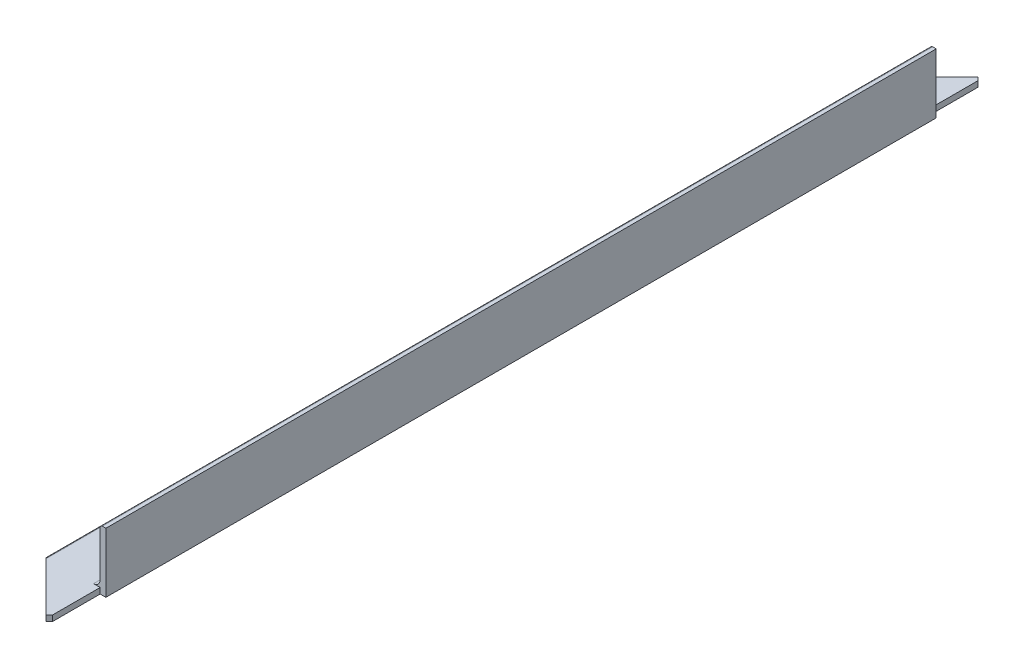
ISO-10303-21;
HEADER;
FILE_DESCRIPTION(('STEP AP214'),'2;1');
FILE_NAME('part.step','',(''),(''),'','','');
FILE_SCHEMA(('AUTOMOTIVE_DESIGN { 1 0 10303 214 1 1 1 1 }'));
ENDSEC;
DATA;
#1=APPLICATION_CONTEXT('core data for automotive mechanical design processes');
#2=APPLICATION_PROTOCOL_DEFINITION('international standard','automotive_design',2000,#1);
#3=PRODUCT_CONTEXT('',#1,'mechanical');
#4=PRODUCT('Part','Part','',(#3));
#5=PRODUCT_RELATED_PRODUCT_CATEGORY('part','',(#4));
#6=PRODUCT_DEFINITION_FORMATION('','',#4);
#7=PRODUCT_DEFINITION_CONTEXT('part definition',#1,'design');
#8=PRODUCT_DEFINITION('design','',#6,#7);
#9=PRODUCT_DEFINITION_SHAPE('','',#8);
#10=(LENGTH_UNIT() NAMED_UNIT(*) SI_UNIT(.MILLI.,.METRE.));
#11=(NAMED_UNIT(*) PLANE_ANGLE_UNIT() SI_UNIT($,.RADIAN.));
#12=(NAMED_UNIT(*) SI_UNIT($,.STERADIAN.) SOLID_ANGLE_UNIT());
#13=UNCERTAINTY_MEASURE_WITH_UNIT(LENGTH_MEASURE(1.E-05),#10,'distance_accuracy_value','');
#14=(GEOMETRIC_REPRESENTATION_CONTEXT(3) GLOBAL_UNCERTAINTY_ASSIGNED_CONTEXT((#13)) GLOBAL_UNIT_ASSIGNED_CONTEXT((#10,
#11,#12)) REPRESENTATION_CONTEXT('',''));
#15=CARTESIAN_POINT('',(0.,0.,0.));
#16=DIRECTION('',(0.,0.,1.));
#17=DIRECTION('',(1.,0.,0.));
#18=AXIS2_PLACEMENT_3D('',#15,#16,#17);
#19=CARTESIAN_POINT('',(737.,213.,-500.));
#20=DIRECTION('',(0.,0.,1.));
#21=DIRECTION('',(1.,0.,0.));
#22=AXIS2_PLACEMENT_3D('',#19,#20,#21);
#23=CYLINDRICAL_SURFACE('',#22,7.00000000000001);
#24=CARTESIAN_POINT('',(737.,213.,437.));
#25=DIRECTION('',(0.,0.,1.));
#26=DIRECTION('',(1.,0.,0.));
#27=AXIS2_PLACEMENT_3D('',#24,#25,#26);
#28=CIRCLE('',#27,7.00000000000001);
#29=CARTESIAN_POINT('',(744.00000000001,213.,437.));
#30=VERTEX_POINT('',#29);
#31=CARTESIAN_POINT('',(737.00000000001,206.,437.));
#32=VERTEX_POINT('',#31);
#33=EDGE_CURVE('E162',#30,#32,#28,.F.);
#34=ORIENTED_EDGE('',*,*,#33,.F.);
#35=DIRECTION('',(0.,0.,1.));
#36=VECTOR('',#35,1.);
#37=CARTESIAN_POINT('',(744.,213.,-500.));
#38=LINE('',#37,#36);
#39=CARTESIAN_POINT('',(744.,213.,-437.));
#40=VERTEX_POINT('',#39);
#41=EDGE_CURVE('E208',#40,#30,#38,.T.);
#42=ORIENTED_EDGE('',*,*,#41,.F.);
#43=CARTESIAN_POINT('',(737.,213.,-437.));
#44=DIRECTION('',(0.,0.,-1.));
#45=DIRECTION('',(-1.,0.,0.));
#46=AXIS2_PLACEMENT_3D('',#43,#44,#45);
#47=CIRCLE('',#46,7.00000000000001);
#48=CARTESIAN_POINT('',(737.,206.,-437.));
#49=VERTEX_POINT('',#48);
#50=EDGE_CURVE('E44',#49,#40,#47,.F.);
#51=ORIENTED_EDGE('',*,*,#50,.F.);
#52=DIRECTION('',(0.,0.,1.));
#53=VECTOR('',#52,1.);
#54=CARTESIAN_POINT('',(737.,206.,-500.));
#55=LINE('',#54,#53);
#56=EDGE_CURVE('E240',#49,#32,#55,.T.);
#57=ORIENTED_EDGE('',*,*,#56,.T.);
#58=EDGE_LOOP('',(#34,#42,#51,#57));
#59=FACE_BOUND('',#58,.T.);
#60=ADVANCED_FACE('F36',(#59),#23,.F.);
#61=CARTESIAN_POINT('',(750.,200.,500.));
#62=DIRECTION('',(-0.707106781186547,0.,0.707106781186548));
#63=DIRECTION('',(0.707106781186548,0.,0.707106781186547));
#64=AXIS2_PLACEMENT_3D('',#61,#62,#63);
#65=PLANE('',#64);
#66=DIRECTION('',(0.,-1.,0.));
#67=VECTOR('',#66,1.);
#68=CARTESIAN_POINT('',(740.5,200.,490.5));
#69=LINE('',#68,#67);
#70=CARTESIAN_POINT('',(740.5,206.,490.5));
#71=VERTEX_POINT('',#70);
#72=CARTESIAN_POINT('',(740.5,200.,490.5));
#73=VERTEX_POINT('',#72);
#74=EDGE_CURVE('E187',#71,#73,#69,.T.);
#75=ORIENTED_EDGE('',*,*,#74,.F.);
#76=DIRECTION('',(-0.707106781186548,0.,-0.707106781186547));
#77=VECTOR('',#76,1.);
#78=CARTESIAN_POINT('',(243.5,206.,-6.49999999999962));
#79=LINE('',#78,#77);
#80=CARTESIAN_POINT('',(689.3,206.,439.3));
#81=VERTEX_POINT('',#80);
#82=EDGE_CURVE('E50',#71,#81,#79,.T.);
#83=ORIENTED_EDGE('',*,*,#82,.T.);
#84=CARTESIAN_POINT('',(689.3,203.7,439.3));
#85=DIRECTION('',(-0.707106781186547,0.,0.707106781186548));
#86=DIRECTION('',(0.707106781186548,0.,0.707106781186547));
#87=AXIS2_PLACEMENT_3D('',#84,#85,#86);
#88=ELLIPSE('',#87,3.25269119345807,2.29999999999997);
#89=CARTESIAN_POINT('',(687.,203.7,437.));
#90=VERTEX_POINT('',#89);
#91=EDGE_CURVE('E182',#81,#90,#88,.T.);
#92=ORIENTED_EDGE('',*,*,#91,.T.);
#93=DIRECTION('',(0.,1.,0.));
#94=VECTOR('',#93,1.);
#95=CARTESIAN_POINT('',(687.,203.70000000001,437.));
#96=LINE('',#95,#94);
#97=CARTESIAN_POINT('',(687.,200.,437.));
#98=VERTEX_POINT('',#97);
#99=EDGE_CURVE('E190',#98,#90,#96,.T.);
#100=ORIENTED_EDGE('',*,*,#99,.F.);
#101=DIRECTION('',(0.707106781186548,0.,0.707106781186547));
#102=VECTOR('',#101,1.);
#103=CARTESIAN_POINT('',(250.,200.,3.33066907387547E-13));
#104=LINE('',#103,#102);
#105=EDGE_CURVE('E176',#98,#73,#104,.T.);
#106=ORIENTED_EDGE('',*,*,#105,.T.);
#107=EDGE_LOOP('',(#75,#83,#92,#100,#106));
#108=FACE_BOUND('',#107,.T.);
#109=ADVANCED_FACE('F302',(#108),#65,.T.);
#110=CARTESIAN_POINT('',(744.,0.,439.3));
#111=DIRECTION('',(1.,0.,0.));
#112=DIRECTION('',(0.,0.,-1.));
#113=AXIS2_PLACEMENT_3D('',#110,#111,#112);
#114=PLANE('',#113);
#115=DIRECTION('',(0.,1.,0.));
#116=VECTOR('',#115,1.);
#117=CARTESIAN_POINT('',(744.,0.,437.));
#118=LINE('',#117,#116);
#119=CARTESIAN_POINT('',(744.,200.,437.));
#120=VERTEX_POINT('',#119);
#121=CARTESIAN_POINT('',(744.00000000001,206.,437.));
#122=VERTEX_POINT('',#121);
#123=EDGE_CURVE('E82',#120,#122,#118,.T.);
#124=ORIENTED_EDGE('',*,*,#123,.T.);
#125=DIRECTION('',(0.,0.,-1.));
#126=VECTOR('',#125,1.);
#127=CARTESIAN_POINT('',(744.000000000011,206.,490.5));
#128=LINE('',#127,#126);
#129=CARTESIAN_POINT('',(744.000000000011,206.,487.));
#130=VERTEX_POINT('',#129);
#131=EDGE_CURVE('E153',#130,#122,#128,.T.);
#132=ORIENTED_EDGE('',*,*,#131,.F.);
#133=DIRECTION('',(0.,1.,0.));
#134=VECTOR('',#133,1.);
#135=CARTESIAN_POINT('',(744.,0.,487.));
#136=LINE('',#135,#134);
#137=CARTESIAN_POINT('',(744.,200.,487.));
#138=VERTEX_POINT('',#137);
#139=EDGE_CURVE('E174',#138,#130,#136,.T.);
#140=ORIENTED_EDGE('',*,*,#139,.F.);
#141=DIRECTION('',(0.,0.,-1.));
#142=VECTOR('',#141,1.);
#143=CARTESIAN_POINT('',(744.000000000008,200.,-500.));
#144=LINE('',#143,#142);
#145=EDGE_CURVE('E170',#138,#120,#144,.T.);
#146=ORIENTED_EDGE('',*,*,#145,.T.);
#147=EDGE_LOOP('',(#124,#132,#140,#146));
#148=FACE_BOUND('',#147,.T.);
#149=ADVANCED_FACE('F168',(#148),#114,.T.);
#150=CARTESIAN_POINT('',(744.,0.,487.));
#151=DIRECTION('',(-0.707106781186547,0.,-0.707106781186548));
#152=DIRECTION('',(-0.707106781186548,0.,0.707106781186547));
#153=AXIS2_PLACEMENT_3D('',#150,#151,#152);
#154=PLANE('',#153);
#155=DIRECTION('',(0.707106781186548,0.,-0.707106781186547));
#156=VECTOR('',#155,1.);
#157=CARTESIAN_POINT('',(744.,206.,487.));
#158=LINE('',#157,#156);
#159=EDGE_CURVE('E11',#71,#130,#158,.T.);
#160=ORIENTED_EDGE('',*,*,#159,.F.);
#161=ORIENTED_EDGE('',*,*,#74,.T.);
#162=DIRECTION('',(-0.707106781186548,0.,0.707106781186547));
#163=VECTOR('',#162,1.);
#164=CARTESIAN_POINT('',(1240.5,200.,-9.49999999999951));
#165=LINE('',#164,#163);
#166=EDGE_CURVE('E171',#138,#73,#165,.T.);
#167=ORIENTED_EDGE('',*,*,#166,.F.);
#168=ORIENTED_EDGE('',*,*,#139,.T.);
#169=EDGE_LOOP('',(#160,#161,#167,#168));
#170=FACE_BOUND('',#169,.T.);
#171=ADVANCED_FACE('F305',(#170),#154,.F.);
#172=CARTESIAN_POINT('',(750.,200.,-500.));
#173=DIRECTION('',(-0.707106781186548,0.,-0.707106781186547));
#174=DIRECTION('',(-0.707106781186547,0.,0.707106781186548));
#175=AXIS2_PLACEMENT_3D('',#172,#173,#174);
#176=PLANE('',#175);
#177=DIRECTION('',(0.707106781186547,0.,-0.707106781186548));
#178=VECTOR('',#177,1.);
#179=CARTESIAN_POINT('',(743.5,206.,-493.5));
#180=LINE('',#179,#178);
#181=CARTESIAN_POINT('',(689.3,206.,-439.3));
#182=VERTEX_POINT('',#181);
#183=CARTESIAN_POINT('',(740.5,206.,-490.5));
#184=VERTEX_POINT('',#183);
#185=EDGE_CURVE('E246',#182,#184,#180,.T.);
#186=ORIENTED_EDGE('',*,*,#185,.T.);
#187=DIRECTION('',(0.,1.,0.));
#188=VECTOR('',#187,1.);
#189=CARTESIAN_POINT('',(740.5,200.,-490.5));
#190=LINE('',#189,#188);
#191=CARTESIAN_POINT('',(740.5,200.,-490.5));
#192=VERTEX_POINT('',#191);
#193=EDGE_CURVE('E74',#192,#184,#190,.T.);
#194=ORIENTED_EDGE('',*,*,#193,.F.);
#195=DIRECTION('',(-0.707106781186547,0.,0.707106781186548));
#196=VECTOR('',#195,1.);
#197=CARTESIAN_POINT('',(750.,200.,-500.));
#198=LINE('',#197,#196);
#199=CARTESIAN_POINT('',(687.,200.,-437.));
#200=VERTEX_POINT('',#199);
#201=EDGE_CURVE('E235',#192,#200,#198,.T.);
#202=ORIENTED_EDGE('',*,*,#201,.T.);
#203=DIRECTION('',(0.,-1.,0.));
#204=VECTOR('',#203,1.);
#205=CARTESIAN_POINT('',(687.,203.699999999999,-437.));
#206=LINE('',#205,#204);
#207=CARTESIAN_POINT('',(687.,203.7,-437.));
#208=VERTEX_POINT('',#207);
#209=EDGE_CURVE('E226',#208,#200,#206,.T.);
#210=ORIENTED_EDGE('',*,*,#209,.F.);
#211=CARTESIAN_POINT('',(689.3,203.7,-439.3));
#212=DIRECTION('',(-0.707106781186548,0.,-0.707106781186547));
#213=DIRECTION('',(-0.707106781186547,0.,0.707106781186548));
#214=AXIS2_PLACEMENT_3D('',#211,#212,#213);
#215=ELLIPSE('',#214,3.25269119345807,2.29999999999997);
#216=EDGE_CURVE('E248',#208,#182,#215,.T.);
#217=ORIENTED_EDGE('',*,*,#216,.T.);
#218=EDGE_LOOP('',(#186,#194,#202,#210,#217));
#219=FACE_BOUND('',#218,.T.);
#220=ADVANCED_FACE('F38',(#219),#176,.T.);
#221=CARTESIAN_POINT('',(744.,1100.,-439.3));
#222=DIRECTION('',(1.,0.,0.));
#223=DIRECTION('',(0.,0.,-1.));
#224=AXIS2_PLACEMENT_3D('',#221,#222,#223);
#225=PLANE('',#224);
#226=DIRECTION('',(0.,-1.,0.));
#227=VECTOR('',#226,1.);
#228=CARTESIAN_POINT('',(744.,1100.,-487.));
#229=LINE('',#228,#227);
#230=CARTESIAN_POINT('',(744.,206.,-487.));
#231=VERTEX_POINT('',#230);
#232=CARTESIAN_POINT('',(744.,200.,-487.));
#233=VERTEX_POINT('',#232);
#234=EDGE_CURVE('E238',#231,#233,#229,.T.);
#235=ORIENTED_EDGE('',*,*,#234,.F.);
#236=DIRECTION('',(0.,0.,1.));
#237=VECTOR('',#236,1.);
#238=CARTESIAN_POINT('',(744.,206.,-490.5));
#239=LINE('',#238,#237);
#240=CARTESIAN_POINT('',(744.,206.,-437.));
#241=VERTEX_POINT('',#240);
#242=EDGE_CURVE('E284',#231,#241,#239,.T.);
#243=ORIENTED_EDGE('',*,*,#242,.T.);
#244=DIRECTION('',(0.,-1.,0.));
#245=VECTOR('',#244,1.);
#246=CARTESIAN_POINT('',(744.,1100.,-437.));
#247=LINE('',#246,#245);
#248=CARTESIAN_POINT('',(744.,200.,-437.));
#249=VERTEX_POINT('',#248);
#250=EDGE_CURVE('E59',#241,#249,#247,.T.);
#251=ORIENTED_EDGE('',*,*,#250,.T.);
#252=DIRECTION('',(0.,0.,-1.));
#253=VECTOR('',#252,1.);
#254=CARTESIAN_POINT('',(744.,200.,-500.));
#255=LINE('',#254,#253);
#256=EDGE_CURVE('E237',#249,#233,#255,.T.);
#257=ORIENTED_EDGE('',*,*,#256,.T.);
#258=EDGE_LOOP('',(#235,#243,#251,#257));
#259=FACE_BOUND('',#258,.T.);
#260=ADVANCED_FACE('F283',(#259),#225,.T.);
#261=CARTESIAN_POINT('',(744.,1100.,-487.));
#262=DIRECTION('',(-0.707106781186547,0.,0.707106781186548));
#263=DIRECTION('',(0.707106781186548,0.,0.707106781186547));
#264=AXIS2_PLACEMENT_3D('',#261,#262,#263);
#265=PLANE('',#264);
#266=DIRECTION('',(-0.707106781186548,0.,-0.707106781186547));
#267=VECTOR('',#266,1.);
#268=CARTESIAN_POINT('',(744.,206.,-487.));
#269=LINE('',#268,#267);
#270=EDGE_CURVE('E186',#231,#184,#269,.T.);
#271=ORIENTED_EDGE('',*,*,#270,.F.);
#272=ORIENTED_EDGE('',*,*,#234,.T.);
#273=DIRECTION('',(0.707106781186548,0.,0.707106781186547));
#274=VECTOR('',#273,1.);
#275=CARTESIAN_POINT('',(740.5,200.,-490.5));
#276=LINE('',#275,#274);
#277=EDGE_CURVE('E241',#192,#233,#276,.T.);
#278=ORIENTED_EDGE('',*,*,#277,.F.);
#279=ORIENTED_EDGE('',*,*,#193,.T.);
#280=EDGE_LOOP('',(#271,#272,#278,#279));
#281=FACE_BOUND('',#280,.T.);
#282=ADVANCED_FACE('F287',(#281),#265,.F.);
#283=CARTESIAN_POINT('',(737.,206.,-500.));
#284=DIRECTION('',(0.,-1.,0.));
#285=DIRECTION('',(0.,0.,-1.));
#286=AXIS2_PLACEMENT_3D('',#283,#284,#285);
#287=PLANE('',#286);
#288=ORIENTED_EDGE('',*,*,#185,.F.);
#289=DIRECTION('',(0.,0.,1.));
#290=VECTOR('',#289,1.);
#291=CARTESIAN_POINT('',(689.3,206.,-500.));
#292=LINE('',#291,#290);
#293=EDGE_CURVE('E244',#182,#81,#292,.T.);
#294=ORIENTED_EDGE('',*,*,#293,.T.);
#295=ORIENTED_EDGE('',*,*,#82,.F.);
#296=ORIENTED_EDGE('',*,*,#159,.T.);
#297=ORIENTED_EDGE('',*,*,#131,.T.);
#298=DIRECTION('',(1.,0.,0.));
#299=VECTOR('',#298,1.);
#300=CARTESIAN_POINT('',(750.,206.,437.));
#301=LINE('',#300,#299);
#302=EDGE_CURVE('E157',#32,#122,#301,.T.);
#303=ORIENTED_EDGE('',*,*,#302,.F.);
#304=ORIENTED_EDGE('',*,*,#56,.F.);
#305=DIRECTION('',(-1.,0.,0.));
#306=VECTOR('',#305,1.);
#307=CARTESIAN_POINT('',(744.,206.,-437.));
#308=LINE('',#307,#306);
#309=EDGE_CURVE('E258',#241,#49,#308,.T.);
#310=ORIENTED_EDGE('',*,*,#309,.F.);
#311=ORIENTED_EDGE('',*,*,#242,.F.);
#312=ORIENTED_EDGE('',*,*,#270,.T.);
#313=EDGE_LOOP('',(#288,#294,#295,#296,#297,#303,#304,#310,#311,#312));
#314=FACE_BOUND('',#313,.T.);
#315=ADVANCED_FACE('F155',(#314),#287,.F.);
#316=CARTESIAN_POINT('',(689.3,203.7,-500.));
#317=DIRECTION('',(0.,0.,1.));
#318=DIRECTION('',(1.,0.,0.));
#319=AXIS2_PLACEMENT_3D('',#316,#317,#318);
#320=CYLINDRICAL_SURFACE('',#319,2.29999999999997);
#321=ORIENTED_EDGE('',*,*,#216,.F.);
#322=DIRECTION('',(0.,0.,1.));
#323=VECTOR('',#322,1.);
#324=CARTESIAN_POINT('',(687.,203.7,-500.));
#325=LINE('',#324,#323);
#326=EDGE_CURVE('E193',#208,#90,#325,.T.);
#327=ORIENTED_EDGE('',*,*,#326,.T.);
#328=ORIENTED_EDGE('',*,*,#91,.F.);
#329=ORIENTED_EDGE('',*,*,#293,.F.);
#330=EDGE_LOOP('',(#321,#327,#328,#329));
#331=FACE_BOUND('',#330,.T.);
#332=ADVANCED_FACE('F298',(#331),#320,.T.);
#333=CARTESIAN_POINT('',(750.,200.,-500.));
#334=DIRECTION('',(0.,1.,0.));
#335=DIRECTION('',(-1.,0.,0.));
#336=AXIS2_PLACEMENT_3D('',#333,#334,#335);
#337=PLANE('',#336);
#338=ORIENTED_EDGE('',*,*,#201,.F.);
#339=ORIENTED_EDGE('',*,*,#277,.T.);
#340=ORIENTED_EDGE('',*,*,#256,.F.);
#341=DIRECTION('',(-1.,0.,0.));
#342=VECTOR('',#341,1.);
#343=CARTESIAN_POINT('',(750.000000000001,200.,-437.));
#344=LINE('',#343,#342);
#345=CARTESIAN_POINT('',(750.,200.,-437.));
#346=VERTEX_POINT('',#345);
#347=EDGE_CURVE('E218',#346,#249,#344,.T.);
#348=ORIENTED_EDGE('',*,*,#347,.F.);
#349=DIRECTION('',(0.,0.,1.));
#350=VECTOR('',#349,1.);
#351=CARTESIAN_POINT('',(750.,200.,-500.));
#352=LINE('',#351,#350);
#353=CARTESIAN_POINT('',(750.,200.,437.));
#354=VERTEX_POINT('',#353);
#355=EDGE_CURVE('E201',#346,#354,#352,.T.);
#356=ORIENTED_EDGE('',*,*,#355,.T.);
#357=DIRECTION('',(-1.,0.,0.));
#358=VECTOR('',#357,1.);
#359=CARTESIAN_POINT('',(750.,200.,437.));
#360=LINE('',#359,#358);
#361=EDGE_CURVE('E204',#354,#120,#360,.T.);
#362=ORIENTED_EDGE('',*,*,#361,.T.);
#363=ORIENTED_EDGE('',*,*,#145,.F.);
#364=ORIENTED_EDGE('',*,*,#166,.T.);
#365=ORIENTED_EDGE('',*,*,#105,.F.);
#366=DIRECTION('',(0.,0.,1.));
#367=VECTOR('',#366,1.);
#368=CARTESIAN_POINT('',(687.,200.,-500.));
#369=LINE('',#368,#367);
#370=EDGE_CURVE('E194',#200,#98,#369,.T.);
#371=ORIENTED_EDGE('',*,*,#370,.F.);
#372=EDGE_LOOP('',(#338,#339,#340,#348,#356,#362,#363,#364,#365,#371));
#373=FACE_BOUND('',#372,.T.);
#374=ADVANCED_FACE('F281',(#373),#337,.F.);
#375=CARTESIAN_POINT('',(750.,1100.,-437.));
#376=DIRECTION('',(0.,0.,-1.));
#377=DIRECTION('',(-1.,0.,0.));
#378=AXIS2_PLACEMENT_3D('',#375,#376,#377);
#379=PLANE('',#378);
#380=ORIENTED_EDGE('',*,*,#250,.F.);
#381=ORIENTED_EDGE('',*,*,#309,.T.);
#382=ORIENTED_EDGE('',*,*,#50,.T.);
#383=DIRECTION('',(0.,-1.,0.));
#384=VECTOR('',#383,1.);
#385=CARTESIAN_POINT('',(744.,1100.,-437.));
#386=LINE('',#385,#384);
#387=CARTESIAN_POINT('',(744.,260.7,-437.));
#388=VERTEX_POINT('',#387);
#389=EDGE_CURVE('E213',#388,#40,#386,.T.);
#390=ORIENTED_EDGE('',*,*,#389,.F.);
#391=CARTESIAN_POINT('',(746.3,260.7,-437.));
#392=DIRECTION('',(0.,0.,-1.));
#393=DIRECTION('',(-1.,0.,0.));
#394=AXIS2_PLACEMENT_3D('',#391,#392,#393);
#395=CIRCLE('',#394,2.3);
#396=CARTESIAN_POINT('',(746.3,263.,-437.));
#397=VERTEX_POINT('',#396);
#398=EDGE_CURVE('E217',#388,#397,#395,.T.);
#399=ORIENTED_EDGE('',*,*,#398,.T.);
#400=DIRECTION('',(1.,0.,0.));
#401=VECTOR('',#400,1.);
#402=CARTESIAN_POINT('',(750.000000000001,263.,-437.));
#403=LINE('',#402,#401);
#404=CARTESIAN_POINT('',(750.,263.,-437.));
#405=VERTEX_POINT('',#404);
#406=EDGE_CURVE('E212',#397,#405,#403,.T.);
#407=ORIENTED_EDGE('',*,*,#406,.T.);
#408=DIRECTION('',(0.,-1.,0.));
#409=VECTOR('',#408,1.);
#410=CARTESIAN_POINT('',(750.,1100.,-437.));
#411=LINE('',#410,#409);
#412=EDGE_CURVE('E209',#405,#346,#411,.T.);
#413=ORIENTED_EDGE('',*,*,#412,.T.);
#414=ORIENTED_EDGE('',*,*,#347,.T.);
#415=EDGE_LOOP('',(#380,#381,#382,#390,#399,#407,#413,#414));
#416=FACE_BOUND('',#415,.T.);
#417=ADVANCED_FACE('F256',(#416),#379,.T.);
#418=CARTESIAN_POINT('',(750.,0.,437.));
#419=DIRECTION('',(0.,0.,1.));
#420=DIRECTION('',(1.,0.,0.));
#421=AXIS2_PLACEMENT_3D('',#418,#419,#420);
#422=PLANE('',#421);
#423=ORIENTED_EDGE('',*,*,#123,.F.);
#424=ORIENTED_EDGE('',*,*,#361,.F.);
#425=DIRECTION('',(0.,1.,0.));
#426=VECTOR('',#425,1.);
#427=CARTESIAN_POINT('',(750.,0.,437.));
#428=LINE('',#427,#426);
#429=CARTESIAN_POINT('',(750.,263.,437.));
#430=VERTEX_POINT('',#429);
#431=EDGE_CURVE('E224',#354,#430,#428,.T.);
#432=ORIENTED_EDGE('',*,*,#431,.T.);
#433=DIRECTION('',(-1.,0.,0.));
#434=VECTOR('',#433,1.);
#435=CARTESIAN_POINT('',(749.999999999989,263.,437.));
#436=LINE('',#435,#434);
#437=CARTESIAN_POINT('',(746.3,263.,437.));
#438=VERTEX_POINT('',#437);
#439=EDGE_CURVE('E211',#430,#438,#436,.T.);
#440=ORIENTED_EDGE('',*,*,#439,.T.);
#441=CARTESIAN_POINT('',(746.3,260.7,437.));
#442=DIRECTION('',(0.,0.,1.));
#443=DIRECTION('',(1.,0.,0.));
#444=AXIS2_PLACEMENT_3D('',#441,#442,#443);
#445=CIRCLE('',#444,2.3);
#446=CARTESIAN_POINT('',(744.,260.7,437.));
#447=VERTEX_POINT('',#446);
#448=EDGE_CURVE('E222',#438,#447,#445,.T.);
#449=ORIENTED_EDGE('',*,*,#448,.T.);
#450=DIRECTION('',(0.,1.,0.));
#451=VECTOR('',#450,1.);
#452=CARTESIAN_POINT('',(744.,0.,437.));
#453=LINE('',#452,#451);
#454=EDGE_CURVE('E200',#30,#447,#453,.T.);
#455=ORIENTED_EDGE('',*,*,#454,.F.);
#456=ORIENTED_EDGE('',*,*,#33,.T.);
#457=ORIENTED_EDGE('',*,*,#302,.T.);
#458=EDGE_LOOP('',(#423,#424,#432,#440,#449,#455,#456,#457));
#459=FACE_BOUND('',#458,.T.);
#460=ADVANCED_FACE('F164',(#459),#422,.T.);
#461=CARTESIAN_POINT('',(750.,263.,-500.));
#462=DIRECTION('',(-1.,0.,0.));
#463=DIRECTION('',(0.,0.,1.));
#464=AXIS2_PLACEMENT_3D('',#461,#462,#463);
#465=PLANE('',#464);
#466=ORIENTED_EDGE('',*,*,#431,.F.);
#467=ORIENTED_EDGE('',*,*,#355,.F.);
#468=ORIENTED_EDGE('',*,*,#412,.F.);
#469=DIRECTION('',(0.,0.,1.));
#470=VECTOR('',#469,1.);
#471=CARTESIAN_POINT('',(750.,263.,-500.));
#472=LINE('',#471,#470);
#473=EDGE_CURVE('E197',#405,#430,#472,.T.);
#474=ORIENTED_EDGE('',*,*,#473,.T.);
#475=EDGE_LOOP('',(#466,#467,#468,#474));
#476=FACE_BOUND('',#475,.T.);
#477=ADVANCED_FACE('F275',(#476),#465,.F.);
#478=CARTESIAN_POINT('',(750.,263.,-500.));
#479=DIRECTION('',(0.,-1.,0.));
#480=DIRECTION('',(1.,0.,0.));
#481=AXIS2_PLACEMENT_3D('',#478,#479,#480);
#482=PLANE('',#481);
#483=ORIENTED_EDGE('',*,*,#439,.F.);
#484=ORIENTED_EDGE('',*,*,#473,.F.);
#485=ORIENTED_EDGE('',*,*,#406,.F.);
#486=DIRECTION('',(0.,0.,1.));
#487=VECTOR('',#486,1.);
#488=CARTESIAN_POINT('',(746.3,263.,-500.));
#489=LINE('',#488,#487);
#490=EDGE_CURVE('E189',#397,#438,#489,.T.);
#491=ORIENTED_EDGE('',*,*,#490,.T.);
#492=EDGE_LOOP('',(#483,#484,#485,#491));
#493=FACE_BOUND('',#492,.T.);
#494=ADVANCED_FACE('F272',(#493),#482,.F.);
#495=CARTESIAN_POINT('',(746.3,260.7,-500.));
#496=DIRECTION('',(0.,0.,1.));
#497=DIRECTION('',(1.,0.,0.));
#498=AXIS2_PLACEMENT_3D('',#495,#496,#497);
#499=CYLINDRICAL_SURFACE('',#498,2.3);
#500=ORIENTED_EDGE('',*,*,#448,.F.);
#501=ORIENTED_EDGE('',*,*,#490,.F.);
#502=ORIENTED_EDGE('',*,*,#398,.F.);
#503=DIRECTION('',(0.,0.,1.));
#504=VECTOR('',#503,1.);
#505=CARTESIAN_POINT('',(744.,260.7,-500.));
#506=LINE('',#505,#504);
#507=EDGE_CURVE('E205',#388,#447,#506,.T.);
#508=ORIENTED_EDGE('',*,*,#507,.T.);
#509=EDGE_LOOP('',(#500,#501,#502,#508));
#510=FACE_BOUND('',#509,.T.);
#511=ADVANCED_FACE('F265',(#510),#499,.T.);
#512=CARTESIAN_POINT('',(744.,260.7,-500.));
#513=DIRECTION('',(1.,0.,0.));
#514=DIRECTION('',(0.,1.,0.));
#515=AXIS2_PLACEMENT_3D('',#512,#513,#514);
#516=PLANE('',#515);
#517=ORIENTED_EDGE('',*,*,#454,.T.);
#518=ORIENTED_EDGE('',*,*,#507,.F.);
#519=ORIENTED_EDGE('',*,*,#389,.T.);
#520=ORIENTED_EDGE('',*,*,#41,.T.);
#521=EDGE_LOOP('',(#517,#518,#519,#520));
#522=FACE_BOUND('',#521,.T.);
#523=ADVANCED_FACE('F262',(#522),#516,.F.);
#524=CARTESIAN_POINT('',(687.,203.7,-500.));
#525=DIRECTION('',(1.,0.,0.));
#526=DIRECTION('',(0.,1.,0.));
#527=AXIS2_PLACEMENT_3D('',#524,#525,#526);
#528=PLANE('',#527);
#529=ORIENTED_EDGE('',*,*,#326,.F.);
#530=ORIENTED_EDGE('',*,*,#209,.T.);
#531=ORIENTED_EDGE('',*,*,#370,.T.);
#532=ORIENTED_EDGE('',*,*,#99,.T.);
#533=EDGE_LOOP('',(#529,#530,#531,#532));
#534=FACE_BOUND('',#533,.T.);
#535=ADVANCED_FACE('F308',(#534),#528,.F.);
#536=CLOSED_SHELL('',(#60,#109,#149,#171,#220,#260,#282,#315,#332,#374,#417,#460,#477,#494,#511,
#523,#535));
#537=MANIFOLD_SOLID_BREP('B2',#536);
#538=ADVANCED_BREP_SHAPE_REPRESENTATION('',(#18,#537),#14);
#539=SHAPE_DEFINITION_REPRESENTATION(#9,#538);
ENDSEC;
END-ISO-10303-21;
